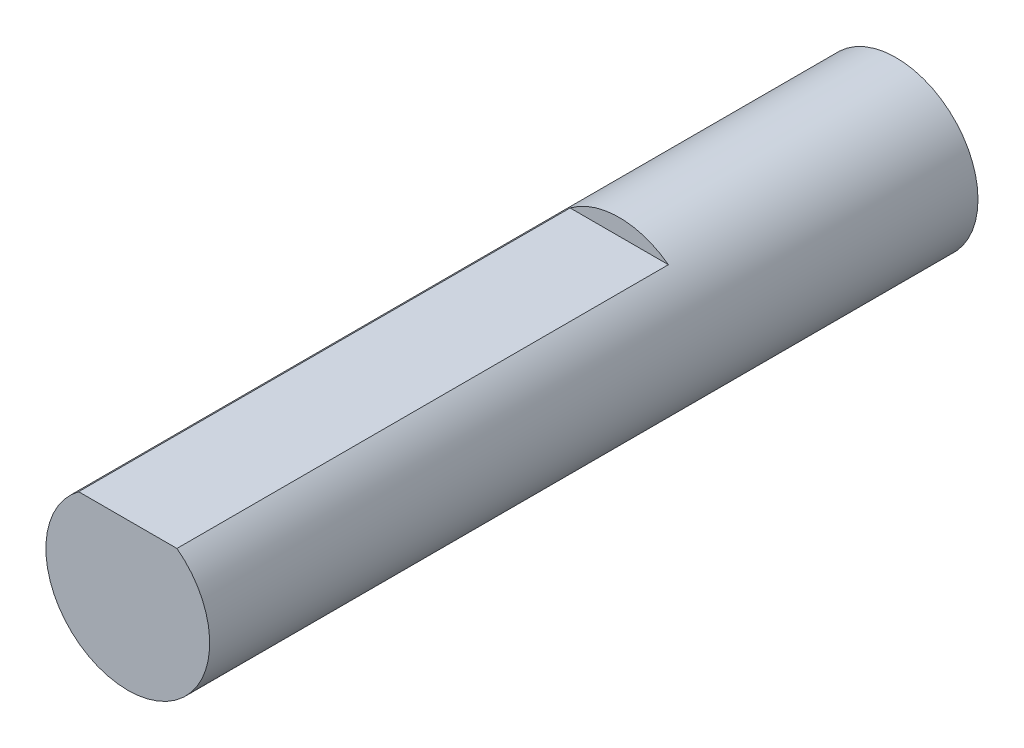
ISO-10303-21;
HEADER;
FILE_DESCRIPTION(('STEP AP214'),'2;1');
FILE_NAME('part.step','',(''),(''),'','','');
FILE_SCHEMA(('AUTOMOTIVE_DESIGN { 1 0 10303 214 1 1 1 1 }'));
ENDSEC;
DATA;
#1=APPLICATION_CONTEXT('core data for automotive mechanical design processes');
#2=APPLICATION_PROTOCOL_DEFINITION('international standard','automotive_design',2000,#1);
#3=PRODUCT_CONTEXT('',#1,'mechanical');
#4=PRODUCT('Part','Part','',(#3));
#5=PRODUCT_RELATED_PRODUCT_CATEGORY('part','',(#4));
#6=PRODUCT_DEFINITION_FORMATION('','',#4);
#7=PRODUCT_DEFINITION_CONTEXT('part definition',#1,'design');
#8=PRODUCT_DEFINITION('design','',#6,#7);
#9=PRODUCT_DEFINITION_SHAPE('','',#8);
#10=(LENGTH_UNIT() NAMED_UNIT(*) SI_UNIT(.MILLI.,.METRE.));
#11=(NAMED_UNIT(*) PLANE_ANGLE_UNIT() SI_UNIT($,.RADIAN.));
#12=(NAMED_UNIT(*) SI_UNIT($,.STERADIAN.) SOLID_ANGLE_UNIT());
#13=UNCERTAINTY_MEASURE_WITH_UNIT(LENGTH_MEASURE(1.E-05),#10,'distance_accuracy_value','');
#14=(GEOMETRIC_REPRESENTATION_CONTEXT(3) GLOBAL_UNCERTAINTY_ASSIGNED_CONTEXT((#13)) GLOBAL_UNIT_ASSIGNED_CONTEXT((#10,
#11,#12)) REPRESENTATION_CONTEXT('',''));
#15=CARTESIAN_POINT('',(0.,0.,0.));
#16=DIRECTION('',(0.,0.,1.));
#17=DIRECTION('',(1.,0.,0.));
#18=AXIS2_PLACEMENT_3D('',#15,#16,#17);
#19=CARTESIAN_POINT('',(0.,0.,23.45));
#20=DIRECTION('',(0.,0.,-1.));
#21=DIRECTION('',(-1.,0.,0.));
#22=AXIS2_PLACEMENT_3D('',#19,#20,#21);
#23=CYLINDRICAL_SURFACE('',#22,2.5);
#24=CARTESIAN_POINT('',(0.,0.,0.));
#25=DIRECTION('',(0.,0.,1.));
#26=DIRECTION('',(1.,0.,0.));
#27=AXIS2_PLACEMENT_3D('',#24,#25,#26);
#28=CIRCLE('',#27,2.5);
#29=CARTESIAN_POINT('',(2.5,0.,0.));
#30=VERTEX_POINT('',#29);
#31=EDGE_CURVE('E42',#30,#30,#28,.T.);
#32=ORIENTED_EDGE('',*,*,#31,.T.);
#33=EDGE_LOOP('',(#32));
#34=FACE_BOUND('',#33,.T.);
#35=DIRECTION('',(0.,0.,1.));
#36=VECTOR('',#35,1.);
#37=CARTESIAN_POINT('',(1.5,2.,8.45));
#38=LINE('',#37,#36);
#39=CARTESIAN_POINT('',(1.5,2.,8.45));
#40=VERTEX_POINT('',#39);
#41=CARTESIAN_POINT('',(1.5,2.,23.45));
#42=VERTEX_POINT('',#41);
#43=EDGE_CURVE('E66',#40,#42,#38,.T.);
#44=ORIENTED_EDGE('',*,*,#43,.T.);
#45=CARTESIAN_POINT('',(0.,0.,23.45));
#46=DIRECTION('',(0.,0.,1.));
#47=DIRECTION('',(1.,0.,0.));
#48=AXIS2_PLACEMENT_3D('',#45,#46,#47);
#49=CIRCLE('',#48,2.5);
#50=CARTESIAN_POINT('',(-1.5,2.,23.45));
#51=VERTEX_POINT('',#50);
#52=EDGE_CURVE('E11',#51,#42,#49,.T.);
#53=ORIENTED_EDGE('',*,*,#52,.F.);
#54=DIRECTION('',(0.,0.,1.));
#55=VECTOR('',#54,1.);
#56=CARTESIAN_POINT('',(-1.5,2.,8.45));
#57=LINE('',#56,#55);
#58=CARTESIAN_POINT('',(-1.5,2.,8.45));
#59=VERTEX_POINT('',#58);
#60=EDGE_CURVE('E53',#59,#51,#57,.T.);
#61=ORIENTED_EDGE('',*,*,#60,.F.);
#62=CARTESIAN_POINT('',(0.,0.,8.45));
#63=DIRECTION('',(0.,0.,1.));
#64=DIRECTION('',(1.,0.,0.));
#65=AXIS2_PLACEMENT_3D('',#62,#63,#64);
#66=CIRCLE('',#65,2.5);
#67=EDGE_CURVE('E72',#40,#59,#66,.T.);
#68=ORIENTED_EDGE('',*,*,#67,.F.);
#69=EDGE_LOOP('',(#44,#53,#61,#68));
#70=FACE_BOUND('',#69,.T.);
#71=ADVANCED_FACE('F39',(#34,#70),#23,.T.);
#72=CARTESIAN_POINT('',(0.,0.,23.45));
#73=DIRECTION('',(0.,0.,1.));
#74=DIRECTION('',(1.,0.,0.));
#75=AXIS2_PLACEMENT_3D('',#72,#73,#74);
#76=PLANE('',#75);
#77=ORIENTED_EDGE('',*,*,#52,.T.);
#78=DIRECTION('',(-1.,0.,0.));
#79=VECTOR('',#78,1.);
#80=CARTESIAN_POINT('',(0.,2.,23.45));
#81=LINE('',#80,#79);
#82=EDGE_CURVE('E63',#42,#51,#81,.T.);
#83=ORIENTED_EDGE('',*,*,#82,.T.);
#84=EDGE_LOOP('',(#77,#83));
#85=FACE_BOUND('',#84,.T.);
#86=ADVANCED_FACE('F74',(#85),#76,.T.);
#87=CARTESIAN_POINT('',(0.,0.,0.));
#88=DIRECTION('',(0.,0.,1.));
#89=DIRECTION('',(1.,0.,0.));
#90=AXIS2_PLACEMENT_3D('',#87,#88,#89);
#91=PLANE('',#90);
#92=ORIENTED_EDGE('',*,*,#31,.F.);
#93=EDGE_LOOP('',(#92));
#94=FACE_BOUND('',#93,.T.);
#95=ADVANCED_FACE('F76',(#94),#91,.F.);
#96=CARTESIAN_POINT('',(0.,2.,8.45));
#97=DIRECTION('',(0.,1.,0.));
#98=DIRECTION('',(0.,0.,1.));
#99=AXIS2_PLACEMENT_3D('',#96,#97,#98);
#100=PLANE('',#99);
#101=ORIENTED_EDGE('',*,*,#82,.F.);
#102=ORIENTED_EDGE('',*,*,#43,.F.);
#103=DIRECTION('',(-1.,0.,0.));
#104=VECTOR('',#103,1.);
#105=CARTESIAN_POINT('',(0.,2.,8.45));
#106=LINE('',#105,#104);
#107=EDGE_CURVE('E59',#40,#59,#106,.T.);
#108=ORIENTED_EDGE('',*,*,#107,.T.);
#109=ORIENTED_EDGE('',*,*,#60,.T.);
#110=EDGE_LOOP('',(#101,#102,#108,#109));
#111=FACE_BOUND('',#110,.T.);
#112=ADVANCED_FACE('F65',(#111),#100,.T.);
#113=CARTESIAN_POINT('',(0.,0.,8.45));
#114=DIRECTION('',(0.,0.,1.));
#115=DIRECTION('',(1.,0.,0.));
#116=AXIS2_PLACEMENT_3D('',#113,#114,#115);
#117=PLANE('',#116);
#118=ORIENTED_EDGE('',*,*,#107,.F.);
#119=ORIENTED_EDGE('',*,*,#67,.T.);
#120=EDGE_LOOP('',(#118,#119));
#121=FACE_BOUND('',#120,.T.);
#122=ADVANCED_FACE('F87',(#121),#117,.T.);
#123=CLOSED_SHELL('',(#71,#86,#95,#112,#122));
#124=MANIFOLD_SOLID_BREP('B2',#123);
#125=ADVANCED_BREP_SHAPE_REPRESENTATION('',(#18,#124),#14);
#126=SHAPE_DEFINITION_REPRESENTATION(#9,#125);
ENDSEC;
END-ISO-10303-21;
